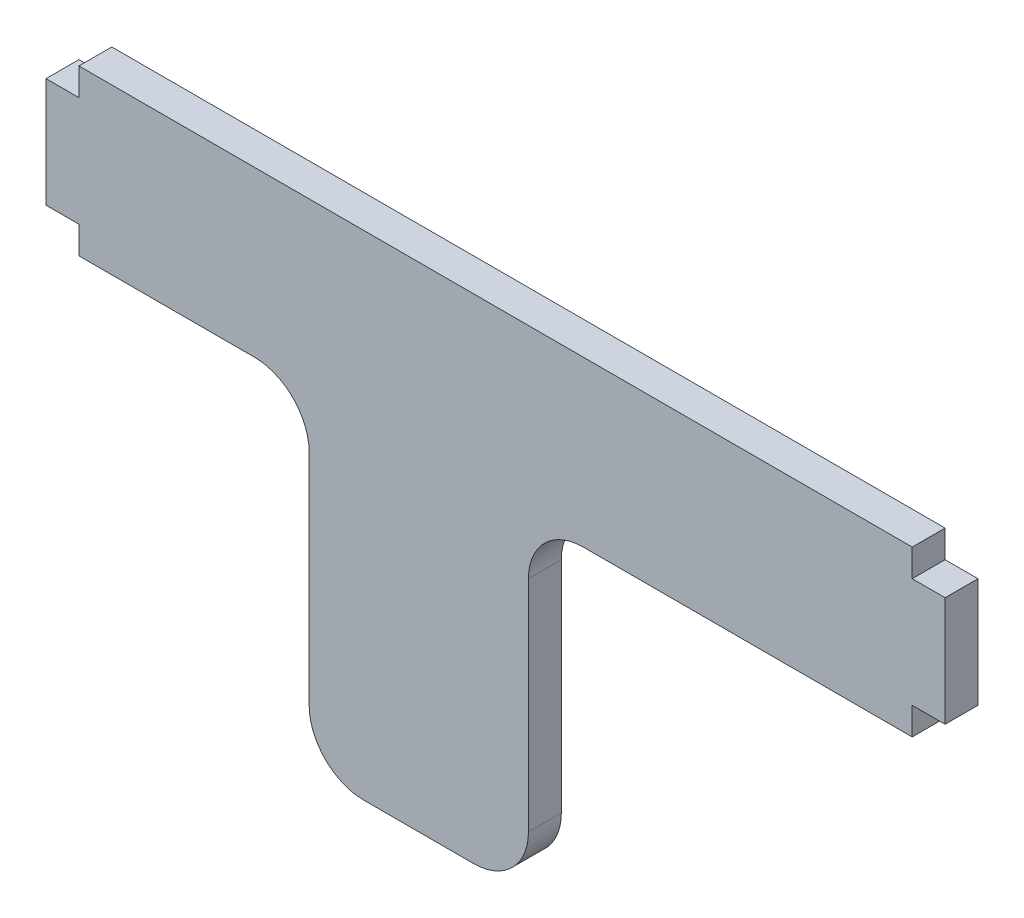
ISO-10303-21;
HEADER;
FILE_DESCRIPTION(('STEP AP214'),'2;1');
FILE_NAME('part.step','',(''),(''),'','','');
FILE_SCHEMA(('AUTOMOTIVE_DESIGN { 1 0 10303 214 1 1 1 1 }'));
ENDSEC;
DATA;
#1=APPLICATION_CONTEXT('core data for automotive mechanical design processes');
#2=APPLICATION_PROTOCOL_DEFINITION('international standard','automotive_design',2000,#1);
#3=PRODUCT_CONTEXT('',#1,'mechanical');
#4=PRODUCT('Part','Part','',(#3));
#5=PRODUCT_RELATED_PRODUCT_CATEGORY('part','',(#4));
#6=PRODUCT_DEFINITION_FORMATION('','',#4);
#7=PRODUCT_DEFINITION_CONTEXT('part definition',#1,'design');
#8=PRODUCT_DEFINITION('design','',#6,#7);
#9=PRODUCT_DEFINITION_SHAPE('','',#8);
#10=(LENGTH_UNIT() NAMED_UNIT(*) SI_UNIT(.MILLI.,.METRE.));
#11=(NAMED_UNIT(*) PLANE_ANGLE_UNIT() SI_UNIT($,.RADIAN.));
#12=(NAMED_UNIT(*) SI_UNIT($,.STERADIAN.) SOLID_ANGLE_UNIT());
#13=UNCERTAINTY_MEASURE_WITH_UNIT(LENGTH_MEASURE(1.E-05),#10,'distance_accuracy_value','');
#14=(GEOMETRIC_REPRESENTATION_CONTEXT(3) GLOBAL_UNCERTAINTY_ASSIGNED_CONTEXT((#13)) GLOBAL_UNIT_ASSIGNED_CONTEXT((#10,
#11,#12)) REPRESENTATION_CONTEXT('',''));
#15=CARTESIAN_POINT('',(0.,0.,0.));
#16=DIRECTION('',(0.,0.,1.));
#17=DIRECTION('',(1.,0.,0.));
#18=AXIS2_PLACEMENT_3D('',#15,#16,#17);
#19=CARTESIAN_POINT('',(-38.,0.,3.));
#20=DIRECTION('',(-1.,0.,0.));
#21=DIRECTION('',(0.,0.,1.));
#22=AXIS2_PLACEMENT_3D('',#19,#20,#21);
#23=PLANE('',#22);
#24=DIRECTION('',(0.,1.,0.));
#25=VECTOR('',#24,1.);
#26=CARTESIAN_POINT('',(-38.,0.,0.));
#27=LINE('',#26,#25);
#28=CARTESIAN_POINT('',(-38.,-7.50000000000001,0.));
#29=VERTEX_POINT('',#28);
#30=CARTESIAN_POINT('',(-38.,-5.,0.));
#31=VERTEX_POINT('',#30);
#32=EDGE_CURVE('E188',#29,#31,#27,.T.);
#33=ORIENTED_EDGE('',*,*,#32,.F.);
#34=DIRECTION('',(0.,0.,-1.));
#35=VECTOR('',#34,1.);
#36=CARTESIAN_POINT('',(-38.,-7.50000000000001,3.));
#37=LINE('',#36,#35);
#38=CARTESIAN_POINT('',(-38.,-7.50000000000001,3.));
#39=VERTEX_POINT('',#38);
#40=EDGE_CURVE('E176',#39,#29,#37,.T.);
#41=ORIENTED_EDGE('',*,*,#40,.F.);
#42=DIRECTION('',(0.,1.,0.));
#43=VECTOR('',#42,1.);
#44=CARTESIAN_POINT('',(-38.,0.,3.));
#45=LINE('',#44,#43);
#46=CARTESIAN_POINT('',(-38.,-5.,3.));
#47=VERTEX_POINT('',#46);
#48=EDGE_CURVE('E182',#39,#47,#45,.T.);
#49=ORIENTED_EDGE('',*,*,#48,.T.);
#50=DIRECTION('',(0.,0.,-1.));
#51=VECTOR('',#50,1.);
#52=CARTESIAN_POINT('',(-38.,-5.,3.));
#53=LINE('',#52,#51);
#54=EDGE_CURVE('E225',#47,#31,#53,.T.);
#55=ORIENTED_EDGE('',*,*,#54,.T.);
#56=EDGE_LOOP('',(#33,#41,#49,#55));
#57=FACE_BOUND('',#56,.T.);
#58=ADVANCED_FACE('F35',(#57),#23,.T.);
#59=CARTESIAN_POINT('',(0.,-7.5,3.));
#60=DIRECTION('',(0.,-1.,0.));
#61=DIRECTION('',(1.,0.,0.));
#62=AXIS2_PLACEMENT_3D('',#59,#60,#61);
#63=PLANE('',#62);
#64=DIRECTION('',(-1.,0.,0.));
#65=VECTOR('',#64,1.);
#66=CARTESIAN_POINT('',(0.,-7.5,0.));
#67=LINE('',#66,#65);
#68=CARTESIAN_POINT('',(-22.,-7.5,0.));
#69=VERTEX_POINT('',#68);
#70=EDGE_CURVE('E227',#69,#29,#67,.T.);
#71=ORIENTED_EDGE('',*,*,#70,.F.);
#72=DIRECTION('',(0.,0.,-1.));
#73=VECTOR('',#72,1.);
#74=CARTESIAN_POINT('',(-22.,-7.5,3.));
#75=LINE('',#74,#73);
#76=CARTESIAN_POINT('',(-22.,-7.5,3.));
#77=VERTEX_POINT('',#76);
#78=EDGE_CURVE('E179',#69,#77,#75,.F.);
#79=ORIENTED_EDGE('',*,*,#78,.T.);
#80=DIRECTION('',(-1.,0.,0.));
#81=VECTOR('',#80,1.);
#82=CARTESIAN_POINT('',(0.,-7.5,3.));
#83=LINE('',#82,#81);
#84=EDGE_CURVE('E172',#77,#39,#83,.T.);
#85=ORIENTED_EDGE('',*,*,#84,.T.);
#86=ORIENTED_EDGE('',*,*,#40,.T.);
#87=EDGE_LOOP('',(#71,#79,#85,#86));
#88=FACE_BOUND('',#87,.T.);
#89=ADVANCED_FACE('F175',(#88),#63,.T.);
#90=CARTESIAN_POINT('',(-17.,0.,3.));
#91=DIRECTION('',(-1.,0.,0.));
#92=DIRECTION('',(0.,0.,1.));
#93=AXIS2_PLACEMENT_3D('',#90,#91,#92);
#94=PLANE('',#93);
#95=DIRECTION('',(0.,1.,0.));
#96=VECTOR('',#95,1.);
#97=CARTESIAN_POINT('',(-17.,0.,0.));
#98=LINE('',#97,#96);
#99=CARTESIAN_POINT('',(-17.,-32.5,0.));
#100=VERTEX_POINT('',#99);
#101=CARTESIAN_POINT('',(-17.,-12.5,0.));
#102=VERTEX_POINT('',#101);
#103=EDGE_CURVE('E230',#100,#102,#98,.T.);
#104=ORIENTED_EDGE('',*,*,#103,.F.);
#105=DIRECTION('',(0.,0.,-1.));
#106=VECTOR('',#105,1.);
#107=CARTESIAN_POINT('',(-17.,-32.5,3.));
#108=LINE('',#107,#106);
#109=CARTESIAN_POINT('',(-17.,-32.5,3.));
#110=VERTEX_POINT('',#109);
#111=EDGE_CURVE('E302',#100,#110,#108,.F.);
#112=ORIENTED_EDGE('',*,*,#111,.T.);
#113=DIRECTION('',(0.,1.,0.));
#114=VECTOR('',#113,1.);
#115=CARTESIAN_POINT('',(-17.,0.,3.));
#116=LINE('',#115,#114);
#117=CARTESIAN_POINT('',(-17.,-12.5,3.));
#118=VERTEX_POINT('',#117);
#119=EDGE_CURVE('E181',#110,#118,#116,.T.);
#120=ORIENTED_EDGE('',*,*,#119,.T.);
#121=DIRECTION('',(0.,0.,-1.));
#122=VECTOR('',#121,1.);
#123=CARTESIAN_POINT('',(-17.,-12.5,0.));
#124=LINE('',#123,#122);
#125=EDGE_CURVE('E299',#118,#102,#124,.T.);
#126=ORIENTED_EDGE('',*,*,#125,.T.);
#127=EDGE_LOOP('',(#104,#112,#120,#126));
#128=FACE_BOUND('',#127,.T.);
#129=ADVANCED_FACE('F370',(#128),#94,.T.);
#130=CARTESIAN_POINT('',(0.,-37.5,3.));
#131=DIRECTION('',(0.,-1.,0.));
#132=DIRECTION('',(0.,0.,-1.));
#133=AXIS2_PLACEMENT_3D('',#130,#131,#132);
#134=PLANE('',#133);
#135=DIRECTION('',(-1.,0.,0.));
#136=VECTOR('',#135,1.);
#137=CARTESIAN_POINT('',(0.,-37.5,0.));
#138=LINE('',#137,#136);
#139=CARTESIAN_POINT('',(-2.00000000000002,-37.5,0.));
#140=VERTEX_POINT('',#139);
#141=CARTESIAN_POINT('',(-12.,-37.5,0.));
#142=VERTEX_POINT('',#141);
#143=EDGE_CURVE('E234',#140,#142,#138,.T.);
#144=ORIENTED_EDGE('',*,*,#143,.F.);
#145=DIRECTION('',(0.,0.,-1.));
#146=VECTOR('',#145,1.);
#147=CARTESIAN_POINT('',(-2.00000000000002,-37.5,3.));
#148=LINE('',#147,#146);
#149=CARTESIAN_POINT('',(-2.00000000000002,-37.5,3.));
#150=VERTEX_POINT('',#149);
#151=EDGE_CURVE('E293',#140,#150,#148,.F.);
#152=ORIENTED_EDGE('',*,*,#151,.T.);
#153=DIRECTION('',(-1.,0.,0.));
#154=VECTOR('',#153,1.);
#155=CARTESIAN_POINT('',(0.,-37.5,3.));
#156=LINE('',#155,#154);
#157=CARTESIAN_POINT('',(-12.,-37.5,3.));
#158=VERTEX_POINT('',#157);
#159=EDGE_CURVE('E328',#150,#158,#156,.T.);
#160=ORIENTED_EDGE('',*,*,#159,.T.);
#161=DIRECTION('',(0.,0.,-1.));
#162=VECTOR('',#161,1.);
#163=CARTESIAN_POINT('',(-12.,-37.5,3.));
#164=LINE('',#163,#162);
#165=EDGE_CURVE('E290',#158,#142,#164,.T.);
#166=ORIENTED_EDGE('',*,*,#165,.T.);
#167=EDGE_LOOP('',(#144,#152,#160,#166));
#168=FACE_BOUND('',#167,.T.);
#169=ADVANCED_FACE('F378',(#168),#134,.T.);
#170=CARTESIAN_POINT('',(2.99999999999998,0.,3.));
#171=DIRECTION('',(-1.,0.,0.));
#172=DIRECTION('',(0.,0.,1.));
#173=AXIS2_PLACEMENT_3D('',#170,#171,#172);
#174=PLANE('',#173);
#175=DIRECTION('',(0.,1.,0.));
#176=VECTOR('',#175,1.);
#177=CARTESIAN_POINT('',(2.99999999999998,0.,3.));
#178=LINE('',#177,#176);
#179=CARTESIAN_POINT('',(2.99999999999998,-32.5,3.));
#180=VERTEX_POINT('',#179);
#181=CARTESIAN_POINT('',(2.99999999999998,-12.5,3.));
#182=VERTEX_POINT('',#181);
#183=EDGE_CURVE('E326',#180,#182,#178,.T.);
#184=ORIENTED_EDGE('',*,*,#183,.F.);
#185=DIRECTION('',(0.,0.,-1.));
#186=VECTOR('',#185,1.);
#187=CARTESIAN_POINT('',(2.99999999999998,-32.5,0.));
#188=LINE('',#187,#186);
#189=CARTESIAN_POINT('',(2.99999999999998,-32.5,0.));
#190=VERTEX_POINT('',#189);
#191=EDGE_CURVE('E283',#180,#190,#188,.T.);
#192=ORIENTED_EDGE('',*,*,#191,.T.);
#193=DIRECTION('',(0.,1.,0.));
#194=VECTOR('',#193,1.);
#195=CARTESIAN_POINT('',(2.99999999999998,0.,0.));
#196=LINE('',#195,#194);
#197=CARTESIAN_POINT('',(2.99999999999998,-12.5,0.));
#198=VERTEX_POINT('',#197);
#199=EDGE_CURVE('E237',#190,#198,#196,.T.);
#200=ORIENTED_EDGE('',*,*,#199,.T.);
#201=DIRECTION('',(0.,0.,-1.));
#202=VECTOR('',#201,1.);
#203=CARTESIAN_POINT('',(2.99999999999998,-12.5,3.));
#204=LINE('',#203,#202);
#205=EDGE_CURVE('E189',#198,#182,#204,.F.);
#206=ORIENTED_EDGE('',*,*,#205,.T.);
#207=EDGE_LOOP('',(#184,#192,#200,#206));
#208=FACE_BOUND('',#207,.T.);
#209=ADVANCED_FACE('F321',(#208),#174,.F.);
#210=CARTESIAN_POINT('',(38.,-7.5,3.));
#211=VERTEX_POINT('',#210);
#212=CARTESIAN_POINT('',(7.99999999999998,-7.5,3.));
#213=VERTEX_POINT('',#212);
#214=EDGE_CURVE('E184',#211,#213,#83,.T.);
#215=ORIENTED_EDGE('',*,*,#214,.T.);
#216=DIRECTION('',(0.,0.,-1.));
#217=VECTOR('',#216,1.);
#218=CARTESIAN_POINT('',(7.99999999999998,-7.5,3.));
#219=LINE('',#218,#217);
#220=CARTESIAN_POINT('',(7.99999999999998,-7.5,0.));
#221=VERTEX_POINT('',#220);
#222=EDGE_CURVE('E305',#213,#221,#219,.T.);
#223=ORIENTED_EDGE('',*,*,#222,.T.);
#224=CARTESIAN_POINT('',(38.,-7.5,0.));
#225=VERTEX_POINT('',#224);
#226=EDGE_CURVE('E231',#225,#221,#67,.T.);
#227=ORIENTED_EDGE('',*,*,#226,.F.);
#228=DIRECTION('',(0.,0.,-1.));
#229=VECTOR('',#228,1.);
#230=CARTESIAN_POINT('',(38.,-7.5,3.));
#231=LINE('',#230,#229);
#232=EDGE_CURVE('E190',#211,#225,#231,.T.);
#233=ORIENTED_EDGE('',*,*,#232,.F.);
#234=EDGE_LOOP('',(#215,#223,#227,#233));
#235=FACE_BOUND('',#234,.T.);
#236=ADVANCED_FACE('F324',(#235),#63,.T.);
#237=CARTESIAN_POINT('',(38.,0.,3.));
#238=DIRECTION('',(-1.,0.,0.));
#239=DIRECTION('',(0.,0.,1.));
#240=AXIS2_PLACEMENT_3D('',#237,#238,#239);
#241=PLANE('',#240);
#242=DIRECTION('',(0.,1.,0.));
#243=VECTOR('',#242,1.);
#244=CARTESIAN_POINT('',(38.,0.,0.));
#245=LINE('',#244,#243);
#246=CARTESIAN_POINT('',(38.,-5.,0.));
#247=VERTEX_POINT('',#246);
#248=EDGE_CURVE('E240',#225,#247,#245,.T.);
#249=ORIENTED_EDGE('',*,*,#248,.T.);
#250=DIRECTION('',(0.,0.,-1.));
#251=VECTOR('',#250,1.);
#252=CARTESIAN_POINT('',(38.,-5.,3.));
#253=LINE('',#252,#251);
#254=CARTESIAN_POINT('',(38.,-5.,3.));
#255=VERTEX_POINT('',#254);
#256=EDGE_CURVE('E279',#255,#247,#253,.T.);
#257=ORIENTED_EDGE('',*,*,#256,.F.);
#258=DIRECTION('',(0.,1.,0.));
#259=VECTOR('',#258,1.);
#260=CARTESIAN_POINT('',(38.,0.,3.));
#261=LINE('',#260,#259);
#262=EDGE_CURVE('E218',#211,#255,#261,.T.);
#263=ORIENTED_EDGE('',*,*,#262,.F.);
#264=ORIENTED_EDGE('',*,*,#232,.T.);
#265=EDGE_LOOP('',(#249,#257,#263,#264));
#266=FACE_BOUND('',#265,.T.);
#267=ADVANCED_FACE('F409',(#266),#241,.F.);
#268=CARTESIAN_POINT('',(0.,-5.,3.));
#269=DIRECTION('',(0.,-1.,0.));
#270=DIRECTION('',(0.,0.,-1.));
#271=AXIS2_PLACEMENT_3D('',#268,#269,#270);
#272=PLANE('',#271);
#273=DIRECTION('',(-1.,0.,0.));
#274=VECTOR('',#273,1.);
#275=CARTESIAN_POINT('',(0.,-5.,0.));
#276=LINE('',#275,#274);
#277=CARTESIAN_POINT('',(41.,-5.,0.));
#278=VERTEX_POINT('',#277);
#279=EDGE_CURVE('E243',#278,#247,#276,.T.);
#280=ORIENTED_EDGE('',*,*,#279,.F.);
#281=DIRECTION('',(0.,0.,-1.));
#282=VECTOR('',#281,1.);
#283=CARTESIAN_POINT('',(41.,-5.,3.));
#284=LINE('',#283,#282);
#285=CARTESIAN_POINT('',(41.,-5.,3.));
#286=VERTEX_POINT('',#285);
#287=EDGE_CURVE('E277',#286,#278,#284,.T.);
#288=ORIENTED_EDGE('',*,*,#287,.F.);
#289=DIRECTION('',(-1.,0.,0.));
#290=VECTOR('',#289,1.);
#291=CARTESIAN_POINT('',(0.,-5.,3.));
#292=LINE('',#291,#290);
#293=EDGE_CURVE('E327',#286,#255,#292,.T.);
#294=ORIENTED_EDGE('',*,*,#293,.T.);
#295=ORIENTED_EDGE('',*,*,#256,.T.);
#296=EDGE_LOOP('',(#280,#288,#294,#295));
#297=FACE_BOUND('',#296,.T.);
#298=ADVANCED_FACE('F416',(#297),#272,.T.);
#299=CARTESIAN_POINT('',(41.,0.,3.));
#300=DIRECTION('',(-1.,0.,0.));
#301=DIRECTION('',(0.,0.,1.));
#302=AXIS2_PLACEMENT_3D('',#299,#300,#301);
#303=PLANE('',#302);
#304=DIRECTION('',(0.,1.,0.));
#305=VECTOR('',#304,1.);
#306=CARTESIAN_POINT('',(41.,0.,0.));
#307=LINE('',#306,#305);
#308=CARTESIAN_POINT('',(41.,5.,0.));
#309=VERTEX_POINT('',#308);
#310=EDGE_CURVE('E247',#278,#309,#307,.T.);
#311=ORIENTED_EDGE('',*,*,#310,.T.);
#312=DIRECTION('',(0.,0.,-1.));
#313=VECTOR('',#312,1.);
#314=CARTESIAN_POINT('',(41.,5.,3.));
#315=LINE('',#314,#313);
#316=CARTESIAN_POINT('',(41.,5.,3.));
#317=VERTEX_POINT('',#316);
#318=EDGE_CURVE('E274',#317,#309,#315,.T.);
#319=ORIENTED_EDGE('',*,*,#318,.F.);
#320=DIRECTION('',(0.,1.,0.));
#321=VECTOR('',#320,1.);
#322=CARTESIAN_POINT('',(41.,0.,3.));
#323=LINE('',#322,#321);
#324=EDGE_CURVE('E335',#286,#317,#323,.T.);
#325=ORIENTED_EDGE('',*,*,#324,.F.);
#326=ORIENTED_EDGE('',*,*,#287,.T.);
#327=EDGE_LOOP('',(#311,#319,#325,#326));
#328=FACE_BOUND('',#327,.T.);
#329=ADVANCED_FACE('F413',(#328),#303,.F.);
#330=CARTESIAN_POINT('',(0.,5.,3.));
#331=DIRECTION('',(0.,-1.,0.));
#332=DIRECTION('',(0.,0.,-1.));
#333=AXIS2_PLACEMENT_3D('',#330,#331,#332);
#334=PLANE('',#333);
#335=DIRECTION('',(-1.,0.,0.));
#336=VECTOR('',#335,1.);
#337=CARTESIAN_POINT('',(0.,5.,0.));
#338=LINE('',#337,#336);
#339=CARTESIAN_POINT('',(38.,5.,0.));
#340=VERTEX_POINT('',#339);
#341=EDGE_CURVE('E249',#309,#340,#338,.T.);
#342=ORIENTED_EDGE('',*,*,#341,.T.);
#343=DIRECTION('',(0.,0.,-1.));
#344=VECTOR('',#343,1.);
#345=CARTESIAN_POINT('',(38.,5.,3.));
#346=LINE('',#345,#344);
#347=CARTESIAN_POINT('',(38.,5.,3.));
#348=VERTEX_POINT('',#347);
#349=EDGE_CURVE('E271',#348,#340,#346,.T.);
#350=ORIENTED_EDGE('',*,*,#349,.F.);
#351=DIRECTION('',(-1.,0.,0.));
#352=VECTOR('',#351,1.);
#353=CARTESIAN_POINT('',(0.,5.,3.));
#354=LINE('',#353,#352);
#355=EDGE_CURVE('E216',#317,#348,#354,.T.);
#356=ORIENTED_EDGE('',*,*,#355,.F.);
#357=ORIENTED_EDGE('',*,*,#318,.T.);
#358=EDGE_LOOP('',(#342,#350,#356,#357));
#359=FACE_BOUND('',#358,.T.);
#360=ADVANCED_FACE('F344',(#359),#334,.F.);
#361=CARTESIAN_POINT('',(38.,7.5,0.));
#362=VERTEX_POINT('',#361);
#363=EDGE_CURVE('E244',#340,#362,#245,.T.);
#364=ORIENTED_EDGE('',*,*,#363,.T.);
#365=DIRECTION('',(0.,0.,-1.));
#366=VECTOR('',#365,1.);
#367=CARTESIAN_POINT('',(38.,7.5,3.));
#368=LINE('',#367,#366);
#369=CARTESIAN_POINT('',(38.,7.5,3.));
#370=VERTEX_POINT('',#369);
#371=EDGE_CURVE('E268',#370,#362,#368,.T.);
#372=ORIENTED_EDGE('',*,*,#371,.F.);
#373=EDGE_CURVE('E212',#348,#370,#261,.T.);
#374=ORIENTED_EDGE('',*,*,#373,.F.);
#375=ORIENTED_EDGE('',*,*,#349,.T.);
#376=EDGE_LOOP('',(#364,#372,#374,#375));
#377=FACE_BOUND('',#376,.T.);
#378=ADVANCED_FACE('F348',(#377),#241,.F.);
#379=CARTESIAN_POINT('',(0.,7.5,3.));
#380=DIRECTION('',(0.,-1.,0.));
#381=DIRECTION('',(1.,0.,0.));
#382=AXIS2_PLACEMENT_3D('',#379,#380,#381);
#383=PLANE('',#382);
#384=DIRECTION('',(-1.,0.,0.));
#385=VECTOR('',#384,1.);
#386=CARTESIAN_POINT('',(0.,7.5,0.));
#387=LINE('',#386,#385);
#388=CARTESIAN_POINT('',(-38.,7.49999999999999,0.));
#389=VERTEX_POINT('',#388);
#390=EDGE_CURVE('E251',#362,#389,#387,.T.);
#391=ORIENTED_EDGE('',*,*,#390,.T.);
#392=DIRECTION('',(0.,0.,-1.));
#393=VECTOR('',#392,1.);
#394=CARTESIAN_POINT('',(-38.,7.49999999999999,3.));
#395=LINE('',#394,#393);
#396=CARTESIAN_POINT('',(-38.,7.49999999999999,3.));
#397=VERTEX_POINT('',#396);
#398=EDGE_CURVE('E266',#397,#389,#395,.T.);
#399=ORIENTED_EDGE('',*,*,#398,.F.);
#400=DIRECTION('',(-1.,0.,0.));
#401=VECTOR('',#400,1.);
#402=CARTESIAN_POINT('',(0.,7.5,3.));
#403=LINE('',#402,#401);
#404=EDGE_CURVE('E206',#370,#397,#403,.T.);
#405=ORIENTED_EDGE('',*,*,#404,.F.);
#406=ORIENTED_EDGE('',*,*,#371,.T.);
#407=EDGE_LOOP('',(#391,#399,#405,#406));
#408=FACE_BOUND('',#407,.T.);
#409=ADVANCED_FACE('F351',(#408),#383,.F.);
#410=CARTESIAN_POINT('',(-38.,5.,0.));
#411=VERTEX_POINT('',#410);
#412=EDGE_CURVE('E228',#411,#389,#27,.T.);
#413=ORIENTED_EDGE('',*,*,#412,.F.);
#414=DIRECTION('',(0.,0.,-1.));
#415=VECTOR('',#414,1.);
#416=CARTESIAN_POINT('',(-38.,5.,3.));
#417=LINE('',#416,#415);
#418=CARTESIAN_POINT('',(-38.,5.,3.));
#419=VERTEX_POINT('',#418);
#420=EDGE_CURVE('E264',#419,#411,#417,.T.);
#421=ORIENTED_EDGE('',*,*,#420,.F.);
#422=EDGE_CURVE('E200',#419,#397,#45,.T.);
#423=ORIENTED_EDGE('',*,*,#422,.T.);
#424=ORIENTED_EDGE('',*,*,#398,.T.);
#425=EDGE_LOOP('',(#413,#421,#423,#424));
#426=FACE_BOUND('',#425,.T.);
#427=ADVANCED_FACE('F354',(#426),#23,.T.);
#428=CARTESIAN_POINT('',(0.,5.,3.));
#429=DIRECTION('',(0.,1.,0.));
#430=DIRECTION('',(0.,0.,1.));
#431=AXIS2_PLACEMENT_3D('',#428,#429,#430);
#432=PLANE('',#431);
#433=DIRECTION('',(1.,0.,0.));
#434=VECTOR('',#433,1.);
#435=CARTESIAN_POINT('',(0.,5.,0.));
#436=LINE('',#435,#434);
#437=CARTESIAN_POINT('',(-41.,5.,0.));
#438=VERTEX_POINT('',#437);
#439=EDGE_CURVE('E254',#438,#411,#436,.T.);
#440=ORIENTED_EDGE('',*,*,#439,.F.);
#441=DIRECTION('',(0.,0.,-1.));
#442=VECTOR('',#441,1.);
#443=CARTESIAN_POINT('',(-41.,5.,3.));
#444=LINE('',#443,#442);
#445=CARTESIAN_POINT('',(-41.,5.,3.));
#446=VERTEX_POINT('',#445);
#447=EDGE_CURVE('E262',#446,#438,#444,.T.);
#448=ORIENTED_EDGE('',*,*,#447,.F.);
#449=DIRECTION('',(1.,0.,0.));
#450=VECTOR('',#449,1.);
#451=CARTESIAN_POINT('',(0.,5.,3.));
#452=LINE('',#451,#450);
#453=EDGE_CURVE('E205',#446,#419,#452,.T.);
#454=ORIENTED_EDGE('',*,*,#453,.T.);
#455=ORIENTED_EDGE('',*,*,#420,.T.);
#456=EDGE_LOOP('',(#440,#448,#454,#455));
#457=FACE_BOUND('',#456,.T.);
#458=ADVANCED_FACE('F359',(#457),#432,.T.);
#459=CARTESIAN_POINT('',(-41.,0.,3.));
#460=DIRECTION('',(-1.,0.,0.));
#461=DIRECTION('',(0.,0.,1.));
#462=AXIS2_PLACEMENT_3D('',#459,#460,#461);
#463=PLANE('',#462);
#464=DIRECTION('',(0.,1.,0.));
#465=VECTOR('',#464,1.);
#466=CARTESIAN_POINT('',(-41.,0.,0.));
#467=LINE('',#466,#465);
#468=CARTESIAN_POINT('',(-41.,-5.,0.));
#469=VERTEX_POINT('',#468);
#470=EDGE_CURVE('E202',#469,#438,#467,.T.);
#471=ORIENTED_EDGE('',*,*,#470,.F.);
#472=DIRECTION('',(0.,0.,-1.));
#473=VECTOR('',#472,1.);
#474=CARTESIAN_POINT('',(-41.,-5.,3.));
#475=LINE('',#474,#473);
#476=CARTESIAN_POINT('',(-41.,-5.,3.));
#477=VERTEX_POINT('',#476);
#478=EDGE_CURVE('E260',#477,#469,#475,.T.);
#479=ORIENTED_EDGE('',*,*,#478,.F.);
#480=DIRECTION('',(0.,1.,0.));
#481=VECTOR('',#480,1.);
#482=CARTESIAN_POINT('',(-41.,0.,3.));
#483=LINE('',#482,#481);
#484=EDGE_CURVE('E210',#477,#446,#483,.T.);
#485=ORIENTED_EDGE('',*,*,#484,.T.);
#486=ORIENTED_EDGE('',*,*,#447,.T.);
#487=EDGE_LOOP('',(#471,#479,#485,#486));
#488=FACE_BOUND('',#487,.T.);
#489=ADVANCED_FACE('F362',(#488),#463,.T.);
#490=CARTESIAN_POINT('',(0.,-5.,3.));
#491=DIRECTION('',(0.,1.,0.));
#492=DIRECTION('',(0.,0.,1.));
#493=AXIS2_PLACEMENT_3D('',#490,#491,#492);
#494=PLANE('',#493);
#495=DIRECTION('',(1.,0.,0.));
#496=VECTOR('',#495,1.);
#497=CARTESIAN_POINT('',(0.,-5.,0.));
#498=LINE('',#497,#496);
#499=EDGE_CURVE('E198',#469,#31,#498,.T.);
#500=ORIENTED_EDGE('',*,*,#499,.T.);
#501=ORIENTED_EDGE('',*,*,#54,.F.);
#502=DIRECTION('',(1.,0.,0.));
#503=VECTOR('',#502,1.);
#504=CARTESIAN_POINT('',(0.,-5.,3.));
#505=LINE('',#504,#503);
#506=EDGE_CURVE('E196',#477,#47,#505,.T.);
#507=ORIENTED_EDGE('',*,*,#506,.F.);
#508=ORIENTED_EDGE('',*,*,#478,.T.);
#509=EDGE_LOOP('',(#500,#501,#507,#508));
#510=FACE_BOUND('',#509,.T.);
#511=ADVANCED_FACE('F364',(#510),#494,.F.);
#512=CARTESIAN_POINT('',(0.,0.,3.));
#513=DIRECTION('',(0.,0.,1.));
#514=DIRECTION('',(1.,0.,0.));
#515=AXIS2_PLACEMENT_3D('',#512,#513,#514);
#516=PLANE('',#515);
#517=ORIENTED_EDGE('',*,*,#159,.F.);
#518=CARTESIAN_POINT('',(-2.00000000000002,-32.5,3.));
#519=DIRECTION('',(0.,0.,1.));
#520=DIRECTION('',(1.,0.,0.));
#521=AXIS2_PLACEMENT_3D('',#518,#519,#520);
#522=CIRCLE('',#521,5.);
#523=EDGE_CURVE('E297',#150,#180,#522,.T.);
#524=ORIENTED_EDGE('',*,*,#523,.T.);
#525=ORIENTED_EDGE('',*,*,#183,.T.);
#526=CARTESIAN_POINT('',(7.99999999999998,-12.5,3.));
#527=DIRECTION('',(0.,0.,1.));
#528=DIRECTION('',(1.,0.,0.));
#529=AXIS2_PLACEMENT_3D('',#526,#527,#528);
#530=CIRCLE('',#529,5.);
#531=EDGE_CURVE('E11',#182,#213,#530,.F.);
#532=ORIENTED_EDGE('',*,*,#531,.T.);
#533=ORIENTED_EDGE('',*,*,#214,.F.);
#534=ORIENTED_EDGE('',*,*,#262,.T.);
#535=ORIENTED_EDGE('',*,*,#293,.F.);
#536=ORIENTED_EDGE('',*,*,#324,.T.);
#537=ORIENTED_EDGE('',*,*,#355,.T.);
#538=ORIENTED_EDGE('',*,*,#373,.T.);
#539=ORIENTED_EDGE('',*,*,#404,.T.);
#540=ORIENTED_EDGE('',*,*,#422,.F.);
#541=ORIENTED_EDGE('',*,*,#453,.F.);
#542=ORIENTED_EDGE('',*,*,#484,.F.);
#543=ORIENTED_EDGE('',*,*,#506,.T.);
#544=ORIENTED_EDGE('',*,*,#48,.F.);
#545=ORIENTED_EDGE('',*,*,#84,.F.);
#546=CARTESIAN_POINT('',(-22.,-12.5,3.));
#547=DIRECTION('',(0.,0.,1.));
#548=DIRECTION('',(1.,0.,0.));
#549=AXIS2_PLACEMENT_3D('',#546,#547,#548);
#550=CIRCLE('',#549,5.);
#551=EDGE_CURVE('E55',#77,#118,#550,.F.);
#552=ORIENTED_EDGE('',*,*,#551,.T.);
#553=ORIENTED_EDGE('',*,*,#119,.F.);
#554=CARTESIAN_POINT('',(-12.,-32.5,3.));
#555=DIRECTION('',(0.,0.,1.));
#556=DIRECTION('',(1.,0.,0.));
#557=AXIS2_PLACEMENT_3D('',#554,#555,#556);
#558=CIRCLE('',#557,5.);
#559=EDGE_CURVE('E295',#110,#158,#558,.T.);
#560=ORIENTED_EDGE('',*,*,#559,.T.);
#561=EDGE_LOOP('',(#517,#524,#525,#532,#533,#534,#535,#536,#537,#538,#539,#540,#541,#542,#543,
#544,#545,#552,#553,#560));
#562=FACE_BOUND('',#561,.T.);
#563=ADVANCED_FACE('F193',(#562),#516,.T.);
#564=CARTESIAN_POINT('',(0.,0.,0.));
#565=DIRECTION('',(0.,0.,1.));
#566=DIRECTION('',(1.,0.,0.));
#567=AXIS2_PLACEMENT_3D('',#564,#565,#566);
#568=PLANE('',#567);
#569=ORIENTED_EDGE('',*,*,#199,.F.);
#570=CARTESIAN_POINT('',(-2.00000000000002,-32.5,0.));
#571=DIRECTION('',(0.,0.,1.));
#572=DIRECTION('',(1.,0.,0.));
#573=AXIS2_PLACEMENT_3D('',#570,#571,#572);
#574=CIRCLE('',#573,5.);
#575=EDGE_CURVE('E288',#190,#140,#574,.F.);
#576=ORIENTED_EDGE('',*,*,#575,.T.);
#577=ORIENTED_EDGE('',*,*,#143,.T.);
#578=CARTESIAN_POINT('',(-12.,-32.5,0.));
#579=DIRECTION('',(0.,0.,1.));
#580=DIRECTION('',(1.,0.,0.));
#581=AXIS2_PLACEMENT_3D('',#578,#579,#580);
#582=CIRCLE('',#581,5.);
#583=EDGE_CURVE('E286',#142,#100,#582,.F.);
#584=ORIENTED_EDGE('',*,*,#583,.T.);
#585=ORIENTED_EDGE('',*,*,#103,.T.);
#586=CARTESIAN_POINT('',(-22.,-12.5,0.));
#587=DIRECTION('',(0.,0.,1.));
#588=DIRECTION('',(1.,0.,0.));
#589=AXIS2_PLACEMENT_3D('',#586,#587,#588);
#590=CIRCLE('',#589,5.);
#591=EDGE_CURVE('E308',#102,#69,#590,.T.);
#592=ORIENTED_EDGE('',*,*,#591,.T.);
#593=ORIENTED_EDGE('',*,*,#70,.T.);
#594=ORIENTED_EDGE('',*,*,#32,.T.);
#595=ORIENTED_EDGE('',*,*,#499,.F.);
#596=ORIENTED_EDGE('',*,*,#470,.T.);
#597=ORIENTED_EDGE('',*,*,#439,.T.);
#598=ORIENTED_EDGE('',*,*,#412,.T.);
#599=ORIENTED_EDGE('',*,*,#390,.F.);
#600=ORIENTED_EDGE('',*,*,#363,.F.);
#601=ORIENTED_EDGE('',*,*,#341,.F.);
#602=ORIENTED_EDGE('',*,*,#310,.F.);
#603=ORIENTED_EDGE('',*,*,#279,.T.);
#604=ORIENTED_EDGE('',*,*,#248,.F.);
#605=ORIENTED_EDGE('',*,*,#226,.T.);
#606=CARTESIAN_POINT('',(7.99999999999998,-12.5,0.));
#607=DIRECTION('',(0.,0.,1.));
#608=DIRECTION('',(1.,0.,0.));
#609=AXIS2_PLACEMENT_3D('',#606,#607,#608);
#610=CIRCLE('',#609,5.);
#611=EDGE_CURVE('E43',#221,#198,#610,.T.);
#612=ORIENTED_EDGE('',*,*,#611,.T.);
#613=EDGE_LOOP('',(#569,#576,#577,#584,#585,#592,#593,#594,#595,#596,#597,#598,#599,#600,#601,
#602,#603,#604,#605,#612));
#614=FACE_BOUND('',#613,.T.);
#615=ADVANCED_FACE('F313',(#614),#568,.F.);
#616=CARTESIAN_POINT('',(-2.00000000000002,-32.5,3.));
#617=DIRECTION('',(0.,0.,1.));
#618=DIRECTION('',(1.,0.,0.));
#619=AXIS2_PLACEMENT_3D('',#616,#617,#618);
#620=CYLINDRICAL_SURFACE('',#619,5.);
#621=ORIENTED_EDGE('',*,*,#523,.F.);
#622=ORIENTED_EDGE('',*,*,#151,.F.);
#623=ORIENTED_EDGE('',*,*,#575,.F.);
#624=ORIENTED_EDGE('',*,*,#191,.F.);
#625=EDGE_LOOP('',(#621,#622,#623,#624));
#626=FACE_BOUND('',#625,.T.);
#627=ADVANCED_FACE('F382',(#626),#620,.T.);
#628=CARTESIAN_POINT('',(-12.,-32.5,3.));
#629=DIRECTION('',(0.,0.,-1.));
#630=DIRECTION('',(-1.,0.,0.));
#631=AXIS2_PLACEMENT_3D('',#628,#629,#630);
#632=CYLINDRICAL_SURFACE('',#631,5.);
#633=ORIENTED_EDGE('',*,*,#559,.F.);
#634=ORIENTED_EDGE('',*,*,#111,.F.);
#635=ORIENTED_EDGE('',*,*,#583,.F.);
#636=ORIENTED_EDGE('',*,*,#165,.F.);
#637=EDGE_LOOP('',(#633,#634,#635,#636));
#638=FACE_BOUND('',#637,.T.);
#639=ADVANCED_FACE('F376',(#638),#632,.T.);
#640=CARTESIAN_POINT('',(-22.,-12.5,3.));
#641=DIRECTION('',(0.,0.,1.));
#642=DIRECTION('',(1.,0.,0.));
#643=AXIS2_PLACEMENT_3D('',#640,#641,#642);
#644=CYLINDRICAL_SURFACE('',#643,5.);
#645=ORIENTED_EDGE('',*,*,#551,.F.);
#646=ORIENTED_EDGE('',*,*,#78,.F.);
#647=ORIENTED_EDGE('',*,*,#591,.F.);
#648=ORIENTED_EDGE('',*,*,#125,.F.);
#649=EDGE_LOOP('',(#645,#646,#647,#648));
#650=FACE_BOUND('',#649,.T.);
#651=ADVANCED_FACE('F366',(#650),#644,.F.);
#652=CARTESIAN_POINT('',(7.99999999999998,-12.5,3.));
#653=DIRECTION('',(0.,0.,-1.));
#654=DIRECTION('',(-1.,0.,0.));
#655=AXIS2_PLACEMENT_3D('',#652,#653,#654);
#656=CYLINDRICAL_SURFACE('',#655,5.);
#657=ORIENTED_EDGE('',*,*,#531,.F.);
#658=ORIENTED_EDGE('',*,*,#205,.F.);
#659=ORIENTED_EDGE('',*,*,#611,.F.);
#660=ORIENTED_EDGE('',*,*,#222,.F.);
#661=EDGE_LOOP('',(#657,#658,#659,#660));
#662=FACE_BOUND('',#661,.T.);
#663=ADVANCED_FACE('F37',(#662),#656,.F.);
#664=CLOSED_SHELL('',(#58,#89,#129,#169,#209,#236,#267,#298,#329,#360,#378,#409,#427,#458,#489,
#511,#563,#615,#627,#639,#651,#663));
#665=MANIFOLD_SOLID_BREP('B2',#664);
#666=ADVANCED_BREP_SHAPE_REPRESENTATION('',(#18,#665),#14);
#667=SHAPE_DEFINITION_REPRESENTATION(#9,#666);
ENDSEC;
END-ISO-10303-21;
